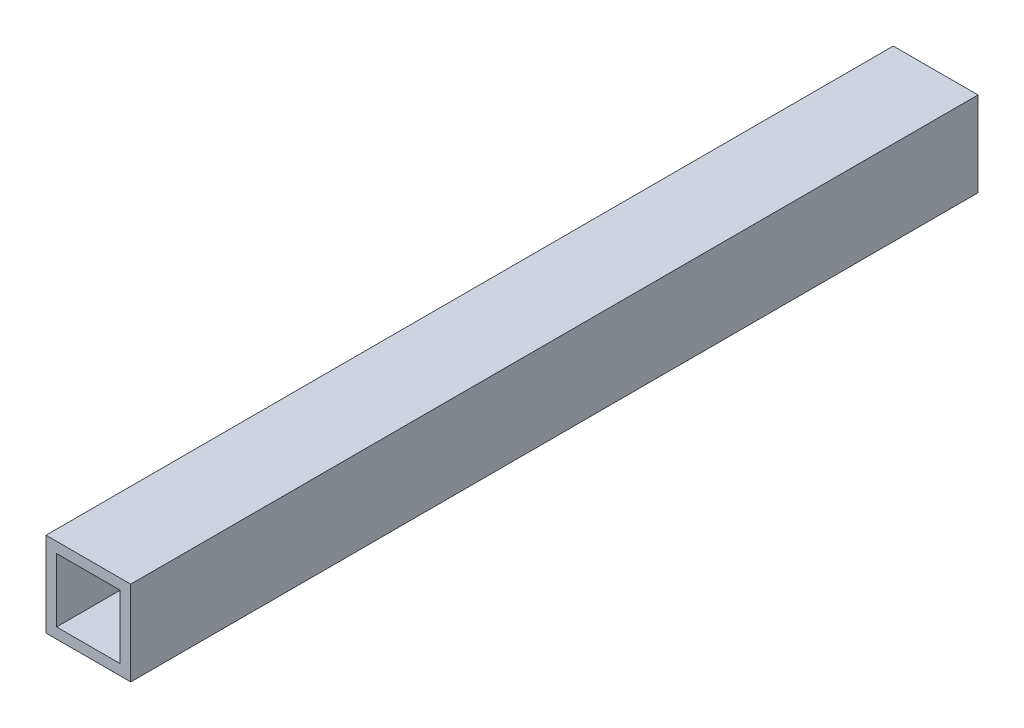
ISO-10303-21;
HEADER;
FILE_DESCRIPTION(('STEP AP214'),'2;1');
FILE_NAME('part.step','',(''),(''),'','','');
FILE_SCHEMA(('AUTOMOTIVE_DESIGN { 1 0 10303 214 1 1 1 1 }'));
ENDSEC;
DATA;
#1=APPLICATION_CONTEXT('core data for automotive mechanical design processes');
#2=APPLICATION_PROTOCOL_DEFINITION('international standard','automotive_design',2000,#1);
#3=PRODUCT_CONTEXT('',#1,'mechanical');
#4=PRODUCT('Part','Part','',(#3));
#5=PRODUCT_RELATED_PRODUCT_CATEGORY('part','',(#4));
#6=PRODUCT_DEFINITION_FORMATION('','',#4);
#7=PRODUCT_DEFINITION_CONTEXT('part definition',#1,'design');
#8=PRODUCT_DEFINITION('design','',#6,#7);
#9=PRODUCT_DEFINITION_SHAPE('','',#8);
#10=(LENGTH_UNIT() NAMED_UNIT(*) SI_UNIT(.MILLI.,.METRE.));
#11=(NAMED_UNIT(*) PLANE_ANGLE_UNIT() SI_UNIT($,.RADIAN.));
#12=(NAMED_UNIT(*) SI_UNIT($,.STERADIAN.) SOLID_ANGLE_UNIT());
#13=UNCERTAINTY_MEASURE_WITH_UNIT(LENGTH_MEASURE(1.E-05),#10,'distance_accuracy_value','');
#14=(GEOMETRIC_REPRESENTATION_CONTEXT(3) GLOBAL_UNCERTAINTY_ASSIGNED_CONTEXT((#13)) GLOBAL_UNIT_ASSIGNED_CONTEXT((#10,
#11,#12)) REPRESENTATION_CONTEXT('',''));
#15=CARTESIAN_POINT('',(0.,0.,0.));
#16=DIRECTION('',(0.,0.,1.));
#17=DIRECTION('',(1.,0.,0.));
#18=AXIS2_PLACEMENT_3D('',#15,#16,#17);
#19=CARTESIAN_POINT('',(0.,0.,254.));
#20=DIRECTION('',(0.,0.,1.));
#21=DIRECTION('',(1.,0.,0.));
#22=AXIS2_PLACEMENT_3D('',#19,#20,#21);
#23=PLANE('',#22);
#24=DIRECTION('',(0.,1.,0.));
#25=VECTOR('',#24,1.);
#26=CARTESIAN_POINT('',(0.,0.,254.));
#27=LINE('',#26,#25);
#28=CARTESIAN_POINT('',(0.,0.,254.));
#29=VERTEX_POINT('',#28);
#30=CARTESIAN_POINT('',(0.,25.4,254.));
#31=VERTEX_POINT('',#30);
#32=EDGE_CURVE('E153',#29,#31,#27,.T.);
#33=ORIENTED_EDGE('',*,*,#32,.T.);
#34=DIRECTION('',(-1.,0.,0.));
#35=VECTOR('',#34,1.);
#36=CARTESIAN_POINT('',(0.,25.4,254.));
#37=LINE('',#36,#35);
#38=CARTESIAN_POINT('',(-25.4,25.4,254.));
#39=VERTEX_POINT('',#38);
#40=EDGE_CURVE('E157',#31,#39,#37,.T.);
#41=ORIENTED_EDGE('',*,*,#40,.T.);
#42=DIRECTION('',(0.,-1.,0.));
#43=VECTOR('',#42,1.);
#44=CARTESIAN_POINT('',(-25.4,0.,254.));
#45=LINE('',#44,#43);
#46=CARTESIAN_POINT('',(-25.4,0.,254.));
#47=VERTEX_POINT('',#46);
#48=EDGE_CURVE('E161',#39,#47,#45,.T.);
#49=ORIENTED_EDGE('',*,*,#48,.T.);
#50=DIRECTION('',(1.,0.,0.));
#51=VECTOR('',#50,1.);
#52=CARTESIAN_POINT('',(0.,0.,254.));
#53=LINE('',#52,#51);
#54=EDGE_CURVE('E164',#47,#29,#53,.T.);
#55=ORIENTED_EDGE('',*,*,#54,.T.);
#56=EDGE_LOOP('',(#33,#41,#49,#55));
#57=FACE_BOUND('',#56,.T.);
#58=DIRECTION('',(-1.,0.,0.));
#59=VECTOR('',#58,1.);
#60=CARTESIAN_POINT('',(-3.175,22.225,254.));
#61=LINE('',#60,#59);
#62=CARTESIAN_POINT('',(-3.175,22.225,254.));
#63=VERTEX_POINT('',#62);
#64=CARTESIAN_POINT('',(-22.225,22.225,254.));
#65=VERTEX_POINT('',#64);
#66=EDGE_CURVE('E114',#63,#65,#61,.T.);
#67=ORIENTED_EDGE('',*,*,#66,.F.);
#68=DIRECTION('',(0.,1.,0.));
#69=VECTOR('',#68,1.);
#70=CARTESIAN_POINT('',(-3.175,3.175,254.));
#71=LINE('',#70,#69);
#72=CARTESIAN_POINT('',(-3.175,3.175,254.));
#73=VERTEX_POINT('',#72);
#74=EDGE_CURVE('E105',#73,#63,#71,.T.);
#75=ORIENTED_EDGE('',*,*,#74,.F.);
#76=DIRECTION('',(1.,0.,0.));
#77=VECTOR('',#76,1.);
#78=CARTESIAN_POINT('',(-3.175,3.175,254.));
#79=LINE('',#78,#77);
#80=CARTESIAN_POINT('',(-22.225,3.175,254.));
#81=VERTEX_POINT('',#80);
#82=EDGE_CURVE('E131',#81,#73,#79,.T.);
#83=ORIENTED_EDGE('',*,*,#82,.F.);
#84=DIRECTION('',(0.,-1.,0.));
#85=VECTOR('',#84,1.);
#86=CARTESIAN_POINT('',(-22.225,3.175,254.));
#87=LINE('',#86,#85);
#88=EDGE_CURVE('E127',#65,#81,#87,.T.);
#89=ORIENTED_EDGE('',*,*,#88,.F.);
#90=EDGE_LOOP('',(#67,#75,#83,#89));
#91=FACE_BOUND('',#90,.T.);
#92=ADVANCED_FACE('F39',(#57,#91),#23,.T.);
#93=CARTESIAN_POINT('',(0.,0.,0.));
#94=DIRECTION('',(0.,0.,1.));
#95=DIRECTION('',(1.,0.,0.));
#96=AXIS2_PLACEMENT_3D('',#93,#94,#95);
#97=PLANE('',#96);
#98=DIRECTION('',(0.,1.,0.));
#99=VECTOR('',#98,1.);
#100=CARTESIAN_POINT('',(0.,0.,0.));
#101=LINE('',#100,#99);
#102=CARTESIAN_POINT('',(0.,0.,0.));
#103=VERTEX_POINT('',#102);
#104=CARTESIAN_POINT('',(0.,25.4,0.));
#105=VERTEX_POINT('',#104);
#106=EDGE_CURVE('E123',#103,#105,#101,.T.);
#107=ORIENTED_EDGE('',*,*,#106,.F.);
#108=DIRECTION('',(1.,0.,0.));
#109=VECTOR('',#108,1.);
#110=CARTESIAN_POINT('',(0.,0.,0.));
#111=LINE('',#110,#109);
#112=CARTESIAN_POINT('',(-25.4,0.,0.));
#113=VERTEX_POINT('',#112);
#114=EDGE_CURVE('E158',#113,#103,#111,.T.);
#115=ORIENTED_EDGE('',*,*,#114,.F.);
#116=DIRECTION('',(0.,-1.,0.));
#117=VECTOR('',#116,1.);
#118=CARTESIAN_POINT('',(-25.4,0.,0.));
#119=LINE('',#118,#117);
#120=CARTESIAN_POINT('',(-25.4,25.4,0.));
#121=VERTEX_POINT('',#120);
#122=EDGE_CURVE('E174',#121,#113,#119,.T.);
#123=ORIENTED_EDGE('',*,*,#122,.F.);
#124=DIRECTION('',(-1.,0.,0.));
#125=VECTOR('',#124,1.);
#126=CARTESIAN_POINT('',(0.,25.4,0.));
#127=LINE('',#126,#125);
#128=EDGE_CURVE('E171',#105,#121,#127,.T.);
#129=ORIENTED_EDGE('',*,*,#128,.F.);
#130=EDGE_LOOP('',(#107,#115,#123,#129));
#131=FACE_BOUND('',#130,.T.);
#132=DIRECTION('',(0.,1.,0.));
#133=VECTOR('',#132,1.);
#134=CARTESIAN_POINT('',(-3.175,3.175,0.));
#135=LINE('',#134,#133);
#136=CARTESIAN_POINT('',(-3.175,3.175,0.));
#137=VERTEX_POINT('',#136);
#138=CARTESIAN_POINT('',(-3.175,22.225,0.));
#139=VERTEX_POINT('',#138);
#140=EDGE_CURVE('E63',#137,#139,#135,.T.);
#141=ORIENTED_EDGE('',*,*,#140,.T.);
#142=DIRECTION('',(-1.,0.,0.));
#143=VECTOR('',#142,1.);
#144=CARTESIAN_POINT('',(-3.175,22.225,0.));
#145=LINE('',#144,#143);
#146=CARTESIAN_POINT('',(-22.225,22.225,0.));
#147=VERTEX_POINT('',#146);
#148=EDGE_CURVE('E121',#139,#147,#145,.T.);
#149=ORIENTED_EDGE('',*,*,#148,.T.);
#150=DIRECTION('',(0.,-1.,0.));
#151=VECTOR('',#150,1.);
#152=CARTESIAN_POINT('',(-22.225,3.175,0.));
#153=LINE('',#152,#151);
#154=CARTESIAN_POINT('',(-22.225,3.175,0.));
#155=VERTEX_POINT('',#154);
#156=EDGE_CURVE('E140',#147,#155,#153,.T.);
#157=ORIENTED_EDGE('',*,*,#156,.T.);
#158=DIRECTION('',(1.,0.,0.));
#159=VECTOR('',#158,1.);
#160=CARTESIAN_POINT('',(-3.175,3.175,0.));
#161=LINE('',#160,#159);
#162=EDGE_CURVE('E115',#155,#137,#161,.T.);
#163=ORIENTED_EDGE('',*,*,#162,.T.);
#164=EDGE_LOOP('',(#141,#149,#157,#163));
#165=FACE_BOUND('',#164,.T.);
#166=ADVANCED_FACE('F197',(#131,#165),#97,.F.);
#167=CARTESIAN_POINT('',(0.,0.,254.));
#168=DIRECTION('',(-1.,0.,0.));
#169=DIRECTION('',(0.,0.,1.));
#170=AXIS2_PLACEMENT_3D('',#167,#168,#169);
#171=PLANE('',#170);
#172=ORIENTED_EDGE('',*,*,#106,.T.);
#173=DIRECTION('',(0.,0.,-1.));
#174=VECTOR('',#173,1.);
#175=CARTESIAN_POINT('',(0.,25.4,254.));
#176=LINE('',#175,#174);
#177=EDGE_CURVE('E11',#31,#105,#176,.T.);
#178=ORIENTED_EDGE('',*,*,#177,.F.);
#179=ORIENTED_EDGE('',*,*,#32,.F.);
#180=DIRECTION('',(0.,0.,-1.));
#181=VECTOR('',#180,1.);
#182=CARTESIAN_POINT('',(0.,0.,254.));
#183=LINE('',#182,#181);
#184=EDGE_CURVE('E167',#29,#103,#183,.T.);
#185=ORIENTED_EDGE('',*,*,#184,.T.);
#186=EDGE_LOOP('',(#172,#178,#179,#185));
#187=FACE_BOUND('',#186,.T.);
#188=ADVANCED_FACE('F41',(#187),#171,.F.);
#189=CARTESIAN_POINT('',(0.,25.4,254.));
#190=DIRECTION('',(0.,-1.,0.));
#191=DIRECTION('',(1.,0.,0.));
#192=AXIS2_PLACEMENT_3D('',#189,#190,#191);
#193=PLANE('',#192);
#194=ORIENTED_EDGE('',*,*,#128,.T.);
#195=DIRECTION('',(0.,0.,-1.));
#196=VECTOR('',#195,1.);
#197=CARTESIAN_POINT('',(-25.4,25.4,254.));
#198=LINE('',#197,#196);
#199=EDGE_CURVE('E48',#39,#121,#198,.T.);
#200=ORIENTED_EDGE('',*,*,#199,.F.);
#201=ORIENTED_EDGE('',*,*,#40,.F.);
#202=ORIENTED_EDGE('',*,*,#177,.T.);
#203=EDGE_LOOP('',(#194,#200,#201,#202));
#204=FACE_BOUND('',#203,.T.);
#205=ADVANCED_FACE('F207',(#204),#193,.F.);
#206=CARTESIAN_POINT('',(-25.4,0.,254.));
#207=DIRECTION('',(1.,0.,0.));
#208=DIRECTION('',(0.,0.,-1.));
#209=AXIS2_PLACEMENT_3D('',#206,#207,#208);
#210=PLANE('',#209);
#211=ORIENTED_EDGE('',*,*,#122,.T.);
#212=DIRECTION('',(0.,0.,-1.));
#213=VECTOR('',#212,1.);
#214=CARTESIAN_POINT('',(-25.4,0.,254.));
#215=LINE('',#214,#213);
#216=EDGE_CURVE('E182',#47,#113,#215,.T.);
#217=ORIENTED_EDGE('',*,*,#216,.F.);
#218=ORIENTED_EDGE('',*,*,#48,.F.);
#219=ORIENTED_EDGE('',*,*,#199,.T.);
#220=EDGE_LOOP('',(#211,#217,#218,#219));
#221=FACE_BOUND('',#220,.T.);
#222=ADVANCED_FACE('F191',(#221),#210,.F.);
#223=CARTESIAN_POINT('',(0.,0.,254.));
#224=DIRECTION('',(0.,1.,0.));
#225=DIRECTION('',(0.,0.,1.));
#226=AXIS2_PLACEMENT_3D('',#223,#224,#225);
#227=PLANE('',#226);
#228=ORIENTED_EDGE('',*,*,#114,.T.);
#229=ORIENTED_EDGE('',*,*,#184,.F.);
#230=ORIENTED_EDGE('',*,*,#54,.F.);
#231=ORIENTED_EDGE('',*,*,#216,.T.);
#232=EDGE_LOOP('',(#228,#229,#230,#231));
#233=FACE_BOUND('',#232,.T.);
#234=ADVANCED_FACE('F201',(#233),#227,.F.);
#235=CARTESIAN_POINT('',(-3.175,3.175,254.));
#236=DIRECTION('',(-1.,0.,0.));
#237=DIRECTION('',(0.,0.,1.));
#238=AXIS2_PLACEMENT_3D('',#235,#236,#237);
#239=PLANE('',#238);
#240=ORIENTED_EDGE('',*,*,#140,.F.);
#241=DIRECTION('',(0.,0.,-1.));
#242=VECTOR('',#241,1.);
#243=CARTESIAN_POINT('',(-3.175,3.175,254.));
#244=LINE('',#243,#242);
#245=EDGE_CURVE('E109',#73,#137,#244,.T.);
#246=ORIENTED_EDGE('',*,*,#245,.F.);
#247=ORIENTED_EDGE('',*,*,#74,.T.);
#248=DIRECTION('',(0.,0.,-1.));
#249=VECTOR('',#248,1.);
#250=CARTESIAN_POINT('',(-3.175,22.225,254.));
#251=LINE('',#250,#249);
#252=EDGE_CURVE('E108',#63,#139,#251,.T.);
#253=ORIENTED_EDGE('',*,*,#252,.T.);
#254=EDGE_LOOP('',(#240,#246,#247,#253));
#255=FACE_BOUND('',#254,.T.);
#256=ADVANCED_FACE('F107',(#255),#239,.T.);
#257=CARTESIAN_POINT('',(-3.175,22.225,254.));
#258=DIRECTION('',(0.,-1.,0.));
#259=DIRECTION('',(1.,0.,0.));
#260=AXIS2_PLACEMENT_3D('',#257,#258,#259);
#261=PLANE('',#260);
#262=ORIENTED_EDGE('',*,*,#148,.F.);
#263=ORIENTED_EDGE('',*,*,#252,.F.);
#264=ORIENTED_EDGE('',*,*,#66,.T.);
#265=DIRECTION('',(0.,0.,-1.));
#266=VECTOR('',#265,1.);
#267=CARTESIAN_POINT('',(-22.225,22.225,254.));
#268=LINE('',#267,#266);
#269=EDGE_CURVE('E124',#65,#147,#268,.T.);
#270=ORIENTED_EDGE('',*,*,#269,.T.);
#271=EDGE_LOOP('',(#262,#263,#264,#270));
#272=FACE_BOUND('',#271,.T.);
#273=ADVANCED_FACE('F118',(#272),#261,.T.);
#274=CARTESIAN_POINT('',(-22.225,3.175,254.));
#275=DIRECTION('',(1.,0.,0.));
#276=DIRECTION('',(0.,0.,-1.));
#277=AXIS2_PLACEMENT_3D('',#274,#275,#276);
#278=PLANE('',#277);
#279=ORIENTED_EDGE('',*,*,#156,.F.);
#280=ORIENTED_EDGE('',*,*,#269,.F.);
#281=ORIENTED_EDGE('',*,*,#88,.T.);
#282=DIRECTION('',(0.,0.,-1.));
#283=VECTOR('',#282,1.);
#284=CARTESIAN_POINT('',(-22.225,3.175,254.));
#285=LINE('',#284,#283);
#286=EDGE_CURVE('E55',#81,#155,#285,.T.);
#287=ORIENTED_EDGE('',*,*,#286,.T.);
#288=EDGE_LOOP('',(#279,#280,#281,#287));
#289=FACE_BOUND('',#288,.T.);
#290=ADVANCED_FACE('F230',(#289),#278,.T.);
#291=CARTESIAN_POINT('',(-3.175,3.175,254.));
#292=DIRECTION('',(0.,1.,0.));
#293=DIRECTION('',(-1.,0.,0.));
#294=AXIS2_PLACEMENT_3D('',#291,#292,#293);
#295=PLANE('',#294);
#296=ORIENTED_EDGE('',*,*,#162,.F.);
#297=ORIENTED_EDGE('',*,*,#286,.F.);
#298=ORIENTED_EDGE('',*,*,#82,.T.);
#299=ORIENTED_EDGE('',*,*,#245,.T.);
#300=EDGE_LOOP('',(#296,#297,#298,#299));
#301=FACE_BOUND('',#300,.T.);
#302=ADVANCED_FACE('F234',(#301),#295,.T.);
#303=CLOSED_SHELL('',(#92,#166,#188,#205,#222,#234,#256,#273,#290,#302));
#304=MANIFOLD_SOLID_BREP('B2',#303);
#305=ADVANCED_BREP_SHAPE_REPRESENTATION('',(#18,#304),#14);
#306=SHAPE_DEFINITION_REPRESENTATION(#9,#305);
ENDSEC;
END-ISO-10303-21;
